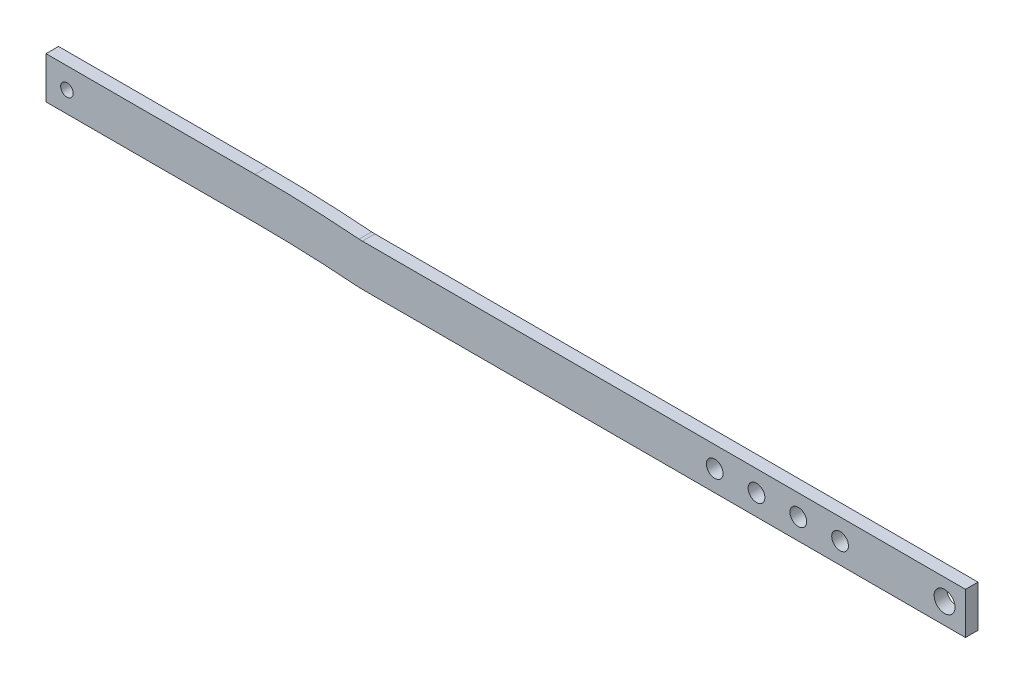
ISO-10303-21;
HEADER;
FILE_DESCRIPTION(('STEP AP214'),'2;1');
FILE_NAME('part.step','',(''),(''),'','','');
FILE_SCHEMA(('AUTOMOTIVE_DESIGN { 1 0 10303 214 1 1 1 1 }'));
ENDSEC;
DATA;
#1=APPLICATION_CONTEXT('core data for automotive mechanical design processes');
#2=APPLICATION_PROTOCOL_DEFINITION('international standard','automotive_design',2000,#1);
#3=PRODUCT_CONTEXT('',#1,'mechanical');
#4=PRODUCT('Part','Part','',(#3));
#5=PRODUCT_RELATED_PRODUCT_CATEGORY('part','',(#4));
#6=PRODUCT_DEFINITION_FORMATION('','',#4);
#7=PRODUCT_DEFINITION_CONTEXT('part definition',#1,'design');
#8=PRODUCT_DEFINITION('design','',#6,#7);
#9=PRODUCT_DEFINITION_SHAPE('','',#8);
#10=(LENGTH_UNIT() NAMED_UNIT(*) SI_UNIT(.MILLI.,.METRE.));
#11=(NAMED_UNIT(*) PLANE_ANGLE_UNIT() SI_UNIT($,.RADIAN.));
#12=(NAMED_UNIT(*) SI_UNIT($,.STERADIAN.) SOLID_ANGLE_UNIT());
#13=UNCERTAINTY_MEASURE_WITH_UNIT(LENGTH_MEASURE(1.E-05),#10,'distance_accuracy_value','');
#14=(GEOMETRIC_REPRESENTATION_CONTEXT(3) GLOBAL_UNCERTAINTY_ASSIGNED_CONTEXT((#13)) GLOBAL_UNIT_ASSIGNED_CONTEXT((#10,
#11,#12)) REPRESENTATION_CONTEXT('',''));
#15=CARTESIAN_POINT('',(0.,0.,0.));
#16=DIRECTION('',(0.,0.,1.));
#17=DIRECTION('',(1.,0.,0.));
#18=AXIS2_PLACEMENT_3D('',#15,#16,#17);
#19=CARTESIAN_POINT('',(0.,-10.000000000033,3.));
#20=DIRECTION('',(1.,0.,0.));
#21=DIRECTION('',(0.,0.,-1.));
#22=AXIS2_PLACEMENT_3D('',#19,#20,#21);
#23=PLANE('',#22);
#24=DIRECTION('',(0.,-1.,0.));
#25=VECTOR('',#24,1.);
#26=CARTESIAN_POINT('',(0.,-10.000000000033,0.));
#27=LINE('',#26,#25);
#28=CARTESIAN_POINT('',(0.,0.,0.));
#29=VERTEX_POINT('',#28);
#30=CARTESIAN_POINT('',(0.,-10.000000000033,0.));
#31=VERTEX_POINT('',#30);
#32=EDGE_CURVE('E141',#29,#31,#27,.T.);
#33=ORIENTED_EDGE('',*,*,#32,.T.);
#34=DIRECTION('',(0.,0.,-1.));
#35=VECTOR('',#34,1.);
#36=CARTESIAN_POINT('',(0.,-10.000000000033,3.));
#37=LINE('',#36,#35);
#38=CARTESIAN_POINT('',(0.,-10.000000000033,3.));
#39=VERTEX_POINT('',#38);
#40=EDGE_CURVE('E11',#39,#31,#37,.T.);
#41=ORIENTED_EDGE('',*,*,#40,.F.);
#42=DIRECTION('',(0.,-1.,0.));
#43=VECTOR('',#42,1.);
#44=CARTESIAN_POINT('',(0.,-10.000000000033,3.));
#45=LINE('',#44,#43);
#46=CARTESIAN_POINT('',(0.,0.,3.));
#47=VERTEX_POINT('',#46);
#48=EDGE_CURVE('E160',#47,#39,#45,.T.);
#49=ORIENTED_EDGE('',*,*,#48,.F.);
#50=DIRECTION('',(0.,0.,-1.));
#51=VECTOR('',#50,1.);
#52=CARTESIAN_POINT('',(0.,0.,3.));
#53=LINE('',#52,#51);
#54=EDGE_CURVE('E137',#47,#29,#53,.T.);
#55=ORIENTED_EDGE('',*,*,#54,.T.);
#56=EDGE_LOOP('',(#33,#41,#49,#55));
#57=FACE_BOUND('',#56,.T.);
#58=ADVANCED_FACE('F33',(#57),#23,.F.);
#59=CARTESIAN_POINT('',(0.,-10.000000000033,3.));
#60=DIRECTION('',(1.05782740327862E-12,1.,0.));
#61=DIRECTION('',(-1.,1.05782740327862E-12,0.));
#62=AXIS2_PLACEMENT_3D('',#59,#60,#61);
#63=PLANE('',#62);
#64=DIRECTION('',(1.,-1.05782740327862E-12,0.));
#65=VECTOR('',#64,1.);
#66=CARTESIAN_POINT('',(0.,-10.000000000033,0.));
#67=LINE('',#66,#65);
#68=CARTESIAN_POINT('',(50.0003295609482,-10.0000000000897,0.));
#69=VERTEX_POINT('',#68);
#70=EDGE_CURVE('E144',#31,#69,#67,.T.);
#71=ORIENTED_EDGE('',*,*,#70,.T.);
#72=DIRECTION('',(0.,0.,-1.));
#73=VECTOR('',#72,1.);
#74=CARTESIAN_POINT('',(50.0003295609482,-10.0000000000897,3.));
#75=LINE('',#74,#73);
#76=CARTESIAN_POINT('',(50.0003295609482,-10.0000000000897,3.));
#77=VERTEX_POINT('',#76);
#78=EDGE_CURVE('E41',#77,#69,#75,.T.);
#79=ORIENTED_EDGE('',*,*,#78,.F.);
#80=DIRECTION('',(1.,-1.05782740327862E-12,0.));
#81=VECTOR('',#80,1.);
#82=CARTESIAN_POINT('',(0.,-10.000000000033,3.));
#83=LINE('',#82,#81);
#84=EDGE_CURVE('E98',#39,#77,#83,.T.);
#85=ORIENTED_EDGE('',*,*,#84,.F.);
#86=ORIENTED_EDGE('',*,*,#40,.T.);
#87=EDGE_LOOP('',(#71,#79,#85,#86));
#88=FACE_BOUND('',#87,.T.);
#89=ADVANCED_FACE('F275',(#88),#63,.F.);
#90=CARTESIAN_POINT('',(50.,-320.720234413461,3.));
#91=DIRECTION('',(0.,0.,-1.));
#92=DIRECTION('',(-1.,0.,0.));
#93=AXIS2_PLACEMENT_3D('',#90,#91,#92);
#94=CYLINDRICAL_SURFACE('',#93,310.720234413546);
#95=CARTESIAN_POINT('',(50.,-320.720234413461,0.));
#96=DIRECTION('',(0.,0.,-1.));
#97=DIRECTION('',(1.,0.,0.));
#98=AXIS2_PLACEMENT_3D('',#95,#96,#97);
#99=CIRCLE('',#98,310.720234413546);
#100=CARTESIAN_POINT('',(74.1449109105321,-10.9395259257911,0.));
#101=VERTEX_POINT('',#100);
#102=EDGE_CURVE('E147',#69,#101,#99,.T.);
#103=ORIENTED_EDGE('',*,*,#102,.T.);
#104=DIRECTION('',(0.,0.,-1.));
#105=VECTOR('',#104,1.);
#106=CARTESIAN_POINT('',(74.1449109105321,-10.9395259257911,3.));
#107=LINE('',#106,#105);
#108=CARTESIAN_POINT('',(74.1449109105321,-10.9395259257911,3.));
#109=VERTEX_POINT('',#108);
#110=EDGE_CURVE('E173',#109,#101,#107,.T.);
#111=ORIENTED_EDGE('',*,*,#110,.F.);
#112=CARTESIAN_POINT('',(50.,-320.720234413461,3.));
#113=DIRECTION('',(0.,0.,-1.));
#114=DIRECTION('',(1.,0.,0.));
#115=AXIS2_PLACEMENT_3D('',#112,#113,#114);
#116=CIRCLE('',#115,310.720234413546);
#117=EDGE_CURVE('E181',#77,#109,#116,.T.);
#118=ORIENTED_EDGE('',*,*,#117,.F.);
#119=ORIENTED_EDGE('',*,*,#78,.T.);
#120=EDGE_LOOP('',(#103,#111,#118,#119));
#121=FACE_BOUND('',#120,.T.);
#122=ADVANCED_FACE('F179',(#121),#94,.F.);
#123=CARTESIAN_POINT('',(75.6990363414715,8.99999999994448,3.));
#124=DIRECTION('',(0.,0.,-1.));
#125=DIRECTION('',(-1.,0.,0.));
#126=AXIS2_PLACEMENT_3D('',#123,#124,#125);
#127=CYLINDRICAL_SURFACE('',#126,19.9999999999543);
#128=CARTESIAN_POINT('',(75.6990363414715,8.99999999994448,0.));
#129=DIRECTION('',(0.,0.,1.));
#130=DIRECTION('',(-1.,0.,0.));
#131=AXIS2_PLACEMENT_3D('',#128,#129,#130);
#132=CIRCLE('',#131,19.9999999999543);
#133=CARTESIAN_POINT('',(75.6990363414715,-11.0000000000201,0.));
#134=VERTEX_POINT('',#133);
#135=EDGE_CURVE('E149',#101,#134,#132,.T.);
#136=ORIENTED_EDGE('',*,*,#135,.T.);
#137=DIRECTION('',(0.,0.,-1.));
#138=VECTOR('',#137,1.);
#139=CARTESIAN_POINT('',(75.6990363414715,-11.0000000000201,3.));
#140=LINE('',#139,#138);
#141=CARTESIAN_POINT('',(75.6990363414715,-11.0000000000201,3.));
#142=VERTEX_POINT('',#141);
#143=EDGE_CURVE('E170',#142,#134,#140,.T.);
#144=ORIENTED_EDGE('',*,*,#143,.F.);
#145=CARTESIAN_POINT('',(75.6990363414715,8.99999999994448,3.));
#146=DIRECTION('',(0.,0.,1.));
#147=DIRECTION('',(-1.,0.,0.));
#148=AXIS2_PLACEMENT_3D('',#145,#146,#147);
#149=CIRCLE('',#148,19.9999999999543);
#150=EDGE_CURVE('E199',#109,#142,#149,.T.);
#151=ORIENTED_EDGE('',*,*,#150,.F.);
#152=ORIENTED_EDGE('',*,*,#110,.T.);
#153=EDGE_LOOP('',(#136,#144,#151,#152));
#154=FACE_BOUND('',#153,.T.);
#155=ADVANCED_FACE('F190',(#154),#127,.T.);
#156=CARTESIAN_POINT('',(220.,-11.0000000000201,3.));
#157=DIRECTION('',(0.,1.,0.));
#158=DIRECTION('',(0.,0.,1.));
#159=AXIS2_PLACEMENT_3D('',#156,#157,#158);
#160=PLANE('',#159);
#161=DIRECTION('',(1.,0.,0.));
#162=VECTOR('',#161,1.);
#163=CARTESIAN_POINT('',(220.,-11.0000000000201,0.));
#164=LINE('',#163,#162);
#165=CARTESIAN_POINT('',(220.,-11.0000000000201,0.));
#166=VERTEX_POINT('',#165);
#167=EDGE_CURVE('E151',#134,#166,#164,.T.);
#168=ORIENTED_EDGE('',*,*,#167,.T.);
#169=DIRECTION('',(0.,0.,-1.));
#170=VECTOR('',#169,1.);
#171=CARTESIAN_POINT('',(220.,-11.0000000000201,3.));
#172=LINE('',#171,#170);
#173=CARTESIAN_POINT('',(220.,-11.0000000000201,3.));
#174=VERTEX_POINT('',#173);
#175=EDGE_CURVE('E167',#174,#166,#172,.T.);
#176=ORIENTED_EDGE('',*,*,#175,.F.);
#177=DIRECTION('',(1.,0.,0.));
#178=VECTOR('',#177,1.);
#179=CARTESIAN_POINT('',(220.,-11.0000000000201,3.));
#180=LINE('',#179,#178);
#181=EDGE_CURVE('E196',#142,#174,#180,.T.);
#182=ORIENTED_EDGE('',*,*,#181,.F.);
#183=ORIENTED_EDGE('',*,*,#143,.T.);
#184=EDGE_LOOP('',(#168,#176,#182,#183));
#185=FACE_BOUND('',#184,.T.);
#186=ADVANCED_FACE('F194',(#185),#160,.F.);
#187=CARTESIAN_POINT('',(220.,-1.00000000006291,3.));
#188=DIRECTION('',(-1.,0.,0.));
#189=DIRECTION('',(0.,-1.,0.));
#190=AXIS2_PLACEMENT_3D('',#187,#188,#189);
#191=PLANE('',#190);
#192=DIRECTION('',(0.,1.,0.));
#193=VECTOR('',#192,1.);
#194=CARTESIAN_POINT('',(220.,-1.00000000006291,0.));
#195=LINE('',#194,#193);
#196=CARTESIAN_POINT('',(220.,-1.00000000006291,0.));
#197=VERTEX_POINT('',#196);
#198=EDGE_CURVE('E153',#166,#197,#195,.T.);
#199=ORIENTED_EDGE('',*,*,#198,.T.);
#200=DIRECTION('',(0.,0.,-1.));
#201=VECTOR('',#200,1.);
#202=CARTESIAN_POINT('',(220.,-1.00000000006291,3.));
#203=LINE('',#202,#201);
#204=CARTESIAN_POINT('',(220.,-1.00000000006291,3.));
#205=VERTEX_POINT('',#204);
#206=EDGE_CURVE('E164',#205,#197,#203,.T.);
#207=ORIENTED_EDGE('',*,*,#206,.F.);
#208=DIRECTION('',(0.,1.,0.));
#209=VECTOR('',#208,1.);
#210=CARTESIAN_POINT('',(220.,-1.00000000006291,3.));
#211=LINE('',#210,#209);
#212=EDGE_CURVE('E198',#174,#205,#211,.T.);
#213=ORIENTED_EDGE('',*,*,#212,.F.);
#214=ORIENTED_EDGE('',*,*,#175,.T.);
#215=EDGE_LOOP('',(#199,#207,#213,#214));
#216=FACE_BOUND('',#215,.T.);
#217=ADVANCED_FACE('F287',(#216),#191,.F.);
#218=CARTESIAN_POINT('',(75.699036341471,-1.00000000006026,3.));
#219=DIRECTION('',(0.,-1.,0.));
#220=DIRECTION('',(1.,0.,0.));
#221=AXIS2_PLACEMENT_3D('',#218,#219,#220);
#222=PLANE('',#221);
#223=DIRECTION('',(-1.,0.,0.));
#224=VECTOR('',#223,1.);
#225=CARTESIAN_POINT('',(75.699036341471,-1.00000000006026,0.));
#226=LINE('',#225,#224);
#227=CARTESIAN_POINT('',(75.699036341471,-1.00000000006042,0.));
#228=VERTEX_POINT('',#227);
#229=EDGE_CURVE('E155',#197,#228,#226,.T.);
#230=ORIENTED_EDGE('',*,*,#229,.T.);
#231=DIRECTION('',(0.,0.,-1.));
#232=VECTOR('',#231,1.);
#233=CARTESIAN_POINT('',(75.699036341471,-1.00000000006042,3.));
#234=LINE('',#233,#232);
#235=CARTESIAN_POINT('',(75.699036341471,-1.00000000006042,3.));
#236=VERTEX_POINT('',#235);
#237=EDGE_CURVE('E132',#236,#228,#234,.T.);
#238=ORIENTED_EDGE('',*,*,#237,.F.);
#239=DIRECTION('',(-1.,0.,0.));
#240=VECTOR('',#239,1.);
#241=CARTESIAN_POINT('',(75.699036341471,-1.00000000006026,3.));
#242=LINE('',#241,#240);
#243=EDGE_CURVE('E123',#205,#236,#242,.T.);
#244=ORIENTED_EDGE('',*,*,#243,.F.);
#245=ORIENTED_EDGE('',*,*,#206,.T.);
#246=EDGE_LOOP('',(#230,#238,#244,#245));
#247=FACE_BOUND('',#246,.T.);
#248=ADVANCED_FACE('F284',(#247),#222,.F.);
#249=CARTESIAN_POINT('',(75.6990363414715,8.99999999994448,3.));
#250=DIRECTION('',(0.,0.,-1.));
#251=DIRECTION('',(-1.,0.,0.));
#252=AXIS2_PLACEMENT_3D('',#249,#250,#251);
#253=CYLINDRICAL_SURFACE('',#252,10.0000000000049);
#254=CARTESIAN_POINT('',(75.6990363414715,8.99999999994448,0.));
#255=DIRECTION('',(0.,0.,-1.));
#256=DIRECTION('',(1.,0.,0.));
#257=AXIS2_PLACEMENT_3D('',#254,#255,#256);
#258=CIRCLE('',#257,10.0000000000049);
#259=CARTESIAN_POINT('',(74.9219736260108,-0.969762962962084,0.));
#260=VERTEX_POINT('',#259);
#261=EDGE_CURVE('E131',#228,#260,#258,.T.);
#262=ORIENTED_EDGE('',*,*,#261,.T.);
#263=DIRECTION('',(0.,0.,-1.));
#264=VECTOR('',#263,1.);
#265=CARTESIAN_POINT('',(74.9219736260108,-0.969762962962084,3.));
#266=LINE('',#265,#264);
#267=CARTESIAN_POINT('',(74.9219736260108,-0.969762962962084,3.));
#268=VERTEX_POINT('',#267);
#269=EDGE_CURVE('E128',#268,#260,#266,.T.);
#270=ORIENTED_EDGE('',*,*,#269,.F.);
#271=CARTESIAN_POINT('',(75.6990363414715,8.99999999994448,3.));
#272=DIRECTION('',(0.,0.,-1.));
#273=DIRECTION('',(1.,0.,0.));
#274=AXIS2_PLACEMENT_3D('',#271,#272,#273);
#275=CIRCLE('',#274,10.0000000000049);
#276=EDGE_CURVE('E117',#236,#268,#275,.T.);
#277=ORIENTED_EDGE('',*,*,#276,.F.);
#278=ORIENTED_EDGE('',*,*,#237,.T.);
#279=EDGE_LOOP('',(#262,#270,#277,#278));
#280=FACE_BOUND('',#279,.T.);
#281=ADVANCED_FACE('F129',(#280),#253,.F.);
#282=CARTESIAN_POINT('',(50.,-320.720234413461,3.));
#283=DIRECTION('',(0.,0.,-1.));
#284=DIRECTION('',(-1.,0.,0.));
#285=AXIS2_PLACEMENT_3D('',#282,#283,#284);
#286=CYLINDRICAL_SURFACE('',#285,320.720234413471);
#287=CARTESIAN_POINT('',(50.,-320.720234413461,0.));
#288=DIRECTION('',(0.,0.,1.));
#289=DIRECTION('',(-1.,0.,0.));
#290=AXIS2_PLACEMENT_3D('',#287,#288,#289);
#291=CIRCLE('',#290,320.720234413471);
#292=CARTESIAN_POINT('',(50.,0.,0.));
#293=VERTEX_POINT('',#292);
#294=EDGE_CURVE('E84',#260,#293,#291,.T.);
#295=ORIENTED_EDGE('',*,*,#294,.T.);
#296=DIRECTION('',(0.,0.,-1.));
#297=VECTOR('',#296,1.);
#298=CARTESIAN_POINT('',(50.,0.,3.));
#299=LINE('',#298,#297);
#300=CARTESIAN_POINT('',(50.,0.,3.));
#301=VERTEX_POINT('',#300);
#302=EDGE_CURVE('E133',#301,#293,#299,.T.);
#303=ORIENTED_EDGE('',*,*,#302,.F.);
#304=CARTESIAN_POINT('',(50.,-320.720234413461,3.));
#305=DIRECTION('',(0.,0.,1.));
#306=DIRECTION('',(-1.,0.,0.));
#307=AXIS2_PLACEMENT_3D('',#304,#305,#306);
#308=CIRCLE('',#307,320.720234413471);
#309=EDGE_CURVE('E121',#268,#301,#308,.T.);
#310=ORIENTED_EDGE('',*,*,#309,.F.);
#311=ORIENTED_EDGE('',*,*,#269,.T.);
#312=EDGE_LOOP('',(#295,#303,#310,#311));
#313=FACE_BOUND('',#312,.T.);
#314=ADVANCED_FACE('F135',(#313),#286,.T.);
#315=CARTESIAN_POINT('',(0.,0.,3.));
#316=DIRECTION('',(0.,-1.,0.));
#317=DIRECTION('',(0.,0.,-1.));
#318=AXIS2_PLACEMENT_3D('',#315,#316,#317);
#319=PLANE('',#318);
#320=DIRECTION('',(-1.,0.,0.));
#321=VECTOR('',#320,1.);
#322=CARTESIAN_POINT('',(0.,0.,0.));
#323=LINE('',#322,#321);
#324=EDGE_CURVE('E90',#293,#29,#323,.T.);
#325=ORIENTED_EDGE('',*,*,#324,.T.);
#326=ORIENTED_EDGE('',*,*,#54,.F.);
#327=DIRECTION('',(-1.,0.,0.));
#328=VECTOR('',#327,1.);
#329=CARTESIAN_POINT('',(0.,0.,3.));
#330=LINE('',#329,#328);
#331=EDGE_CURVE('E49',#301,#47,#330,.T.);
#332=ORIENTED_EDGE('',*,*,#331,.F.);
#333=ORIENTED_EDGE('',*,*,#302,.T.);
#334=EDGE_LOOP('',(#325,#326,#332,#333));
#335=FACE_BOUND('',#334,.T.);
#336=ADVANCED_FACE('F248',(#335),#319,.F.);
#337=CARTESIAN_POINT('',(50.,-320.720234413461,3.));
#338=DIRECTION('',(0.,0.,-1.));
#339=DIRECTION('',(-1.,0.,0.));
#340=AXIS2_PLACEMENT_3D('',#337,#338,#339);
#341=PLANE('',#340);
#342=CARTESIAN_POINT('',(170.,-6.00000000006256,3.));
#343=DIRECTION('',(0.,0.,1.));
#344=DIRECTION('',(1.,0.,0.));
#345=AXIS2_PLACEMENT_3D('',#342,#343,#344);
#346=CIRCLE('',#345,2.);
#347=CARTESIAN_POINT('',(172.,-6.00000000006256,3.));
#348=VERTEX_POINT('',#347);
#349=EDGE_CURVE('E234',#348,#348,#346,.T.);
#350=ORIENTED_EDGE('',*,*,#349,.F.);
#351=EDGE_LOOP('',(#350));
#352=FACE_BOUND('',#351,.T.);
#353=CARTESIAN_POINT('',(160.,-6.00000000006239,3.));
#354=DIRECTION('',(0.,0.,1.));
#355=DIRECTION('',(1.,0.,0.));
#356=AXIS2_PLACEMENT_3D('',#353,#354,#355);
#357=CIRCLE('',#356,2.);
#358=CARTESIAN_POINT('',(162.,-6.00000000006239,3.));
#359=VERTEX_POINT('',#358);
#360=EDGE_CURVE('E235',#359,#359,#357,.T.);
#361=ORIENTED_EDGE('',*,*,#360,.F.);
#362=EDGE_LOOP('',(#361));
#363=FACE_BOUND('',#362,.T.);
#364=CARTESIAN_POINT('',(180.,-6.00000000006274,3.));
#365=DIRECTION('',(0.,0.,1.));
#366=DIRECTION('',(1.,0.,0.));
#367=AXIS2_PLACEMENT_3D('',#364,#365,#366);
#368=CIRCLE('',#367,2.);
#369=CARTESIAN_POINT('',(182.,-6.00000000006274,3.));
#370=VERTEX_POINT('',#369);
#371=EDGE_CURVE('E227',#370,#370,#368,.T.);
#372=ORIENTED_EDGE('',*,*,#371,.F.);
#373=EDGE_LOOP('',(#372));
#374=FACE_BOUND('',#373,.T.);
#375=CARTESIAN_POINT('',(190.,-6.00000000006291,3.));
#376=DIRECTION('',(0.,0.,1.));
#377=DIRECTION('',(1.,0.,0.));
#378=AXIS2_PLACEMENT_3D('',#375,#376,#377);
#379=CIRCLE('',#378,2.);
#380=CARTESIAN_POINT('',(192.,-6.00000000006291,3.));
#381=VERTEX_POINT('',#380);
#382=EDGE_CURVE('E221',#381,#381,#379,.T.);
#383=ORIENTED_EDGE('',*,*,#382,.F.);
#384=EDGE_LOOP('',(#383));
#385=FACE_BOUND('',#384,.T.);
#386=CARTESIAN_POINT('',(215.,-6.00000000006291,3.));
#387=DIRECTION('',(0.,0.,1.));
#388=DIRECTION('',(1.,0.,0.));
#389=AXIS2_PLACEMENT_3D('',#386,#387,#388);
#390=CIRCLE('',#389,2.50000000001356);
#391=CARTESIAN_POINT('',(217.500000000014,-6.00000000006291,3.));
#392=VERTEX_POINT('',#391);
#393=EDGE_CURVE('E215',#392,#392,#390,.T.);
#394=ORIENTED_EDGE('',*,*,#393,.F.);
#395=EDGE_LOOP('',(#394));
#396=FACE_BOUND('',#395,.T.);
#397=CARTESIAN_POINT('',(5.,-5.,3.));
#398=DIRECTION('',(0.,0.,1.));
#399=DIRECTION('',(1.,0.,0.));
#400=AXIS2_PLACEMENT_3D('',#397,#398,#399);
#401=CIRCLE('',#400,1.5);
#402=CARTESIAN_POINT('',(6.5,-5.,3.));
#403=VERTEX_POINT('',#402);
#404=EDGE_CURVE('E209',#403,#403,#401,.T.);
#405=ORIENTED_EDGE('',*,*,#404,.F.);
#406=EDGE_LOOP('',(#405));
#407=FACE_BOUND('',#406,.T.);
#408=ORIENTED_EDGE('',*,*,#48,.T.);
#409=ORIENTED_EDGE('',*,*,#84,.T.);
#410=ORIENTED_EDGE('',*,*,#117,.T.);
#411=ORIENTED_EDGE('',*,*,#150,.T.);
#412=ORIENTED_EDGE('',*,*,#181,.T.);
#413=ORIENTED_EDGE('',*,*,#212,.T.);
#414=ORIENTED_EDGE('',*,*,#243,.T.);
#415=ORIENTED_EDGE('',*,*,#276,.T.);
#416=ORIENTED_EDGE('',*,*,#309,.T.);
#417=ORIENTED_EDGE('',*,*,#331,.T.);
#418=EDGE_LOOP('',(#408,#409,#410,#411,#412,#413,#414,#415,#416,#417));
#419=FACE_BOUND('',#418,.T.);
#420=ADVANCED_FACE('F119',(#352,#363,#374,#385,#396,#407,#419),#341,.F.);
#421=CARTESIAN_POINT('',(50.,-320.720234413461,0.));
#422=DIRECTION('',(0.,0.,-1.));
#423=DIRECTION('',(-1.,0.,0.));
#424=AXIS2_PLACEMENT_3D('',#421,#422,#423);
#425=PLANE('',#424);
#426=CARTESIAN_POINT('',(170.,-6.00000000006256,0.));
#427=DIRECTION('',(0.,0.,-1.));
#428=DIRECTION('',(-1.,0.,0.));
#429=AXIS2_PLACEMENT_3D('',#426,#427,#428);
#430=CIRCLE('',#429,2.);
#431=CARTESIAN_POINT('',(168.,-6.00000000006256,0.));
#432=VERTEX_POINT('',#431);
#433=EDGE_CURVE('E230',#432,#432,#430,.F.);
#434=ORIENTED_EDGE('',*,*,#433,.T.);
#435=EDGE_LOOP('',(#434));
#436=FACE_BOUND('',#435,.T.);
#437=CARTESIAN_POINT('',(160.,-6.00000000006239,0.));
#438=DIRECTION('',(0.,0.,-1.));
#439=DIRECTION('',(-1.,0.,0.));
#440=AXIS2_PLACEMENT_3D('',#437,#438,#439);
#441=CIRCLE('',#440,2.);
#442=CARTESIAN_POINT('',(158.,-6.00000000006239,0.));
#443=VERTEX_POINT('',#442);
#444=EDGE_CURVE('E231',#443,#443,#441,.F.);
#445=ORIENTED_EDGE('',*,*,#444,.T.);
#446=EDGE_LOOP('',(#445));
#447=FACE_BOUND('',#446,.T.);
#448=CARTESIAN_POINT('',(180.,-6.00000000006274,0.));
#449=DIRECTION('',(0.,0.,-1.));
#450=DIRECTION('',(-1.,0.,0.));
#451=AXIS2_PLACEMENT_3D('',#448,#449,#450);
#452=CIRCLE('',#451,2.);
#453=CARTESIAN_POINT('',(178.,-6.00000000006274,0.));
#454=VERTEX_POINT('',#453);
#455=EDGE_CURVE('E224',#454,#454,#452,.F.);
#456=ORIENTED_EDGE('',*,*,#455,.T.);
#457=EDGE_LOOP('',(#456));
#458=FACE_BOUND('',#457,.T.);
#459=CARTESIAN_POINT('',(190.,-6.00000000006291,0.));
#460=DIRECTION('',(0.,0.,-1.));
#461=DIRECTION('',(-1.,0.,0.));
#462=AXIS2_PLACEMENT_3D('',#459,#460,#461);
#463=CIRCLE('',#462,2.);
#464=CARTESIAN_POINT('',(188.,-6.00000000006291,0.));
#465=VERTEX_POINT('',#464);
#466=EDGE_CURVE('E218',#465,#465,#463,.F.);
#467=ORIENTED_EDGE('',*,*,#466,.T.);
#468=EDGE_LOOP('',(#467));
#469=FACE_BOUND('',#468,.T.);
#470=CARTESIAN_POINT('',(215.,-6.00000000006291,0.));
#471=DIRECTION('',(0.,0.,-1.));
#472=DIRECTION('',(-1.,0.,0.));
#473=AXIS2_PLACEMENT_3D('',#470,#471,#472);
#474=CIRCLE('',#473,2.50000000001356);
#475=CARTESIAN_POINT('',(212.499999999986,-6.00000000006291,0.));
#476=VERTEX_POINT('',#475);
#477=EDGE_CURVE('E212',#476,#476,#474,.F.);
#478=ORIENTED_EDGE('',*,*,#477,.T.);
#479=EDGE_LOOP('',(#478));
#480=FACE_BOUND('',#479,.T.);
#481=CARTESIAN_POINT('',(5.,-5.,0.));
#482=DIRECTION('',(0.,0.,-1.));
#483=DIRECTION('',(-1.,0.,0.));
#484=AXIS2_PLACEMENT_3D('',#481,#482,#483);
#485=CIRCLE('',#484,1.5);
#486=CARTESIAN_POINT('',(3.5,-5.,0.));
#487=VERTEX_POINT('',#486);
#488=EDGE_CURVE('E145',#487,#487,#485,.F.);
#489=ORIENTED_EDGE('',*,*,#488,.T.);
#490=EDGE_LOOP('',(#489));
#491=FACE_BOUND('',#490,.T.);
#492=ORIENTED_EDGE('',*,*,#32,.F.);
#493=ORIENTED_EDGE('',*,*,#324,.F.);
#494=ORIENTED_EDGE('',*,*,#294,.F.);
#495=ORIENTED_EDGE('',*,*,#261,.F.);
#496=ORIENTED_EDGE('',*,*,#229,.F.);
#497=ORIENTED_EDGE('',*,*,#198,.F.);
#498=ORIENTED_EDGE('',*,*,#167,.F.);
#499=ORIENTED_EDGE('',*,*,#135,.F.);
#500=ORIENTED_EDGE('',*,*,#102,.F.);
#501=ORIENTED_EDGE('',*,*,#70,.F.);
#502=EDGE_LOOP('',(#492,#493,#494,#495,#496,#497,#498,#499,#500,#501));
#503=FACE_BOUND('',#502,.T.);
#504=ADVANCED_FACE('F185',(#436,#447,#458,#469,#480,#491,#503),#425,.T.);
#505=CARTESIAN_POINT('',(5.,-5.,-4.24264068711928));
#506=DIRECTION('',(0.,0.,1.));
#507=DIRECTION('',(1.,0.,0.));
#508=AXIS2_PLACEMENT_3D('',#505,#506,#507);
#509=CYLINDRICAL_SURFACE('',#508,1.5);
#510=ORIENTED_EDGE('',*,*,#404,.T.);
#511=EDGE_LOOP('',(#510));
#512=FACE_BOUND('',#511,.T.);
#513=ORIENTED_EDGE('',*,*,#488,.F.);
#514=EDGE_LOOP('',(#513));
#515=FACE_BOUND('',#514,.T.);
#516=ADVANCED_FACE('F260',(#512,#515),#509,.F.);
#517=CARTESIAN_POINT('',(215.,-6.00000000006291,-7.07106781190385));
#518=DIRECTION('',(0.,0.,1.));
#519=DIRECTION('',(1.,0.,0.));
#520=AXIS2_PLACEMENT_3D('',#517,#518,#519);
#521=CYLINDRICAL_SURFACE('',#520,2.50000000001356);
#522=ORIENTED_EDGE('',*,*,#393,.T.);
#523=EDGE_LOOP('',(#522));
#524=FACE_BOUND('',#523,.T.);
#525=ORIENTED_EDGE('',*,*,#477,.F.);
#526=EDGE_LOOP('',(#525));
#527=FACE_BOUND('',#526,.T.);
#528=ADVANCED_FACE('F263',(#524,#527),#521,.F.);
#529=CARTESIAN_POINT('',(190.,-6.00000000006291,-5.65685424949238));
#530=DIRECTION('',(0.,0.,1.));
#531=DIRECTION('',(1.,0.,0.));
#532=AXIS2_PLACEMENT_3D('',#529,#530,#531);
#533=CYLINDRICAL_SURFACE('',#532,2.);
#534=ORIENTED_EDGE('',*,*,#382,.T.);
#535=EDGE_LOOP('',(#534));
#536=FACE_BOUND('',#535,.T.);
#537=ORIENTED_EDGE('',*,*,#466,.F.);
#538=EDGE_LOOP('',(#537));
#539=FACE_BOUND('',#538,.T.);
#540=ADVANCED_FACE('F362',(#536,#539),#533,.F.);
#541=CARTESIAN_POINT('',(180.,-6.00000000006274,-5.65685424949238));
#542=DIRECTION('',(0.,0.,1.));
#543=DIRECTION('',(1.,0.,0.));
#544=AXIS2_PLACEMENT_3D('',#541,#542,#543);
#545=CYLINDRICAL_SURFACE('',#544,2.);
#546=ORIENTED_EDGE('',*,*,#371,.T.);
#547=EDGE_LOOP('',(#546));
#548=FACE_BOUND('',#547,.T.);
#549=ORIENTED_EDGE('',*,*,#455,.F.);
#550=EDGE_LOOP('',(#549));
#551=FACE_BOUND('',#550,.T.);
#552=ADVANCED_FACE('F372',(#548,#551),#545,.F.);
#553=CARTESIAN_POINT('',(160.,-6.00000000006239,-5.65685424949238));
#554=DIRECTION('',(0.,0.,1.));
#555=DIRECTION('',(1.,0.,0.));
#556=AXIS2_PLACEMENT_3D('',#553,#554,#555);
#557=CYLINDRICAL_SURFACE('',#556,2.);
#558=ORIENTED_EDGE('',*,*,#360,.T.);
#559=EDGE_LOOP('',(#558));
#560=FACE_BOUND('',#559,.T.);
#561=ORIENTED_EDGE('',*,*,#444,.F.);
#562=EDGE_LOOP('',(#561));
#563=FACE_BOUND('',#562,.T.);
#564=ADVANCED_FACE('F390',(#560,#563),#557,.F.);
#565=CARTESIAN_POINT('',(170.,-6.00000000006256,-5.65685424949238));
#566=DIRECTION('',(0.,0.,1.));
#567=DIRECTION('',(1.,0.,0.));
#568=AXIS2_PLACEMENT_3D('',#565,#566,#567);
#569=CYLINDRICAL_SURFACE('',#568,2.);
#570=ORIENTED_EDGE('',*,*,#349,.T.);
#571=EDGE_LOOP('',(#570));
#572=FACE_BOUND('',#571,.T.);
#573=ORIENTED_EDGE('',*,*,#433,.F.);
#574=EDGE_LOOP('',(#573));
#575=FACE_BOUND('',#574,.T.);
#576=ADVANCED_FACE('F243',(#572,#575),#569,.F.);
#577=CLOSED_SHELL('',(#58,#89,#122,#155,#186,#217,#248,#281,#314,#336,#420,#504,#516,#528,#540,
#552,#564,#576));
#578=MANIFOLD_SOLID_BREP('B2',#577);
#579=ADVANCED_BREP_SHAPE_REPRESENTATION('',(#18,#578),#14);
#580=SHAPE_DEFINITION_REPRESENTATION(#9,#579);
ENDSEC;
END-ISO-10303-21;
